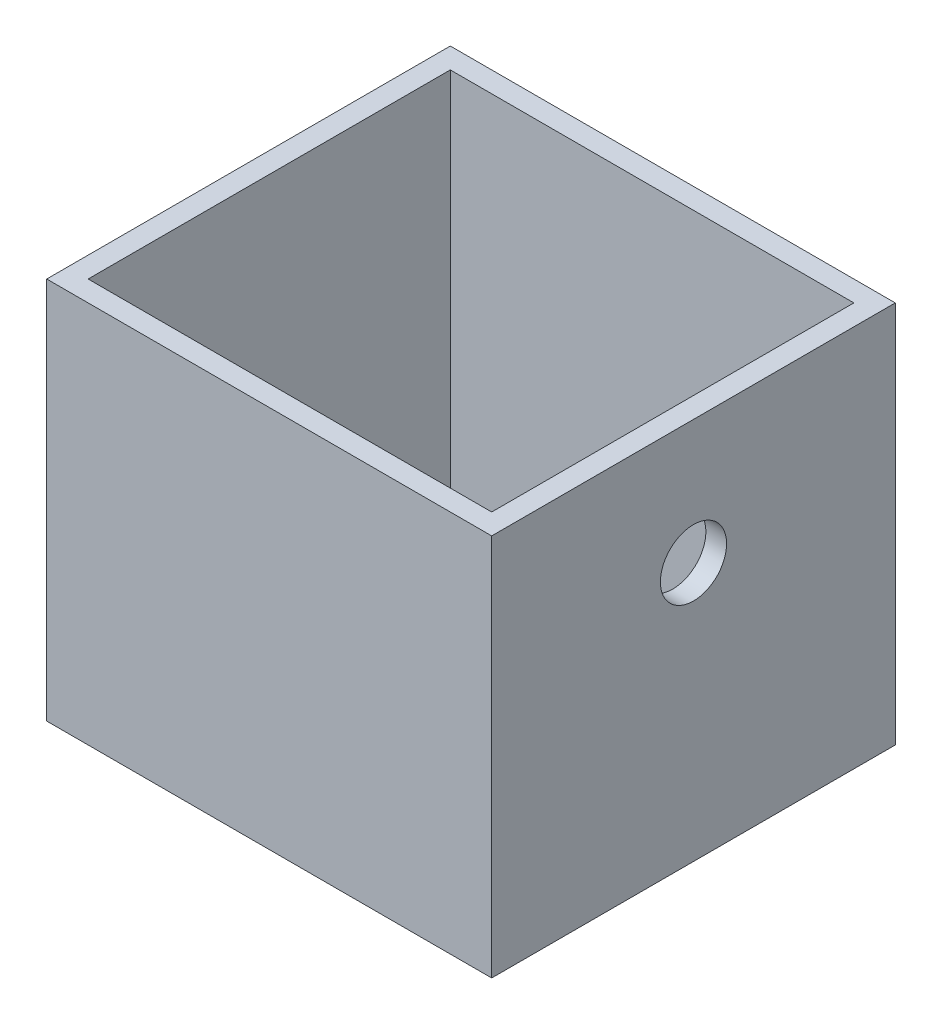
ISO-10303-21;
HEADER;
FILE_DESCRIPTION(('STEP AP214'),'2;1');
FILE_NAME('part.step','',(''),(''),'','','');
FILE_SCHEMA(('AUTOMOTIVE_DESIGN { 1 0 10303 214 1 1 1 1 }'));
ENDSEC;
DATA;
#1=APPLICATION_CONTEXT('core data for automotive mechanical design processes');
#2=APPLICATION_PROTOCOL_DEFINITION('international standard','automotive_design',2000,#1);
#3=PRODUCT_CONTEXT('',#1,'mechanical');
#4=PRODUCT('Part','Part','',(#3));
#5=PRODUCT_RELATED_PRODUCT_CATEGORY('part','',(#4));
#6=PRODUCT_DEFINITION_FORMATION('','',#4);
#7=PRODUCT_DEFINITION_CONTEXT('part definition',#1,'design');
#8=PRODUCT_DEFINITION('design','',#6,#7);
#9=PRODUCT_DEFINITION_SHAPE('','',#8);
#10=(LENGTH_UNIT() NAMED_UNIT(*) SI_UNIT(.MILLI.,.METRE.));
#11=(NAMED_UNIT(*) PLANE_ANGLE_UNIT() SI_UNIT($,.RADIAN.));
#12=(NAMED_UNIT(*) SI_UNIT($,.STERADIAN.) SOLID_ANGLE_UNIT());
#13=UNCERTAINTY_MEASURE_WITH_UNIT(LENGTH_MEASURE(1.E-05),#10,'distance_accuracy_value','');
#14=(GEOMETRIC_REPRESENTATION_CONTEXT(3) GLOBAL_UNCERTAINTY_ASSIGNED_CONTEXT((#13)) GLOBAL_UNIT_ASSIGNED_CONTEXT((#10,
#11,#12)) REPRESENTATION_CONTEXT('',''));
#15=CARTESIAN_POINT('',(0.,0.,0.));
#16=DIRECTION('',(0.,0.,1.));
#17=DIRECTION('',(1.,0.,0.));
#18=AXIS2_PLACEMENT_3D('',#15,#16,#17);
#19=CARTESIAN_POINT('',(215.,370.,-195.));
#20=DIRECTION('',(-1.,0.,0.));
#21=DIRECTION('',(0.,0.,1.));
#22=AXIS2_PLACEMENT_3D('',#19,#20,#21);
#23=PLANE('',#22);
#24=CARTESIAN_POINT('',(215.,250.,0.));
#25=DIRECTION('',(1.,0.,0.));
#26=DIRECTION('',(0.,0.,-1.));
#27=AXIS2_PLACEMENT_3D('',#24,#25,#26);
#28=CIRCLE('',#27,32.);
#29=CARTESIAN_POINT('',(215.,250.,-32.0000000000001));
#30=VERTEX_POINT('',#29);
#31=EDGE_CURVE('E189',#30,#30,#28,.T.);
#32=ORIENTED_EDGE('',*,*,#31,.F.);
#33=EDGE_LOOP('',(#32));
#34=FACE_BOUND('',#33,.T.);
#35=DIRECTION('',(0.,0.,-1.));
#36=VECTOR('',#35,1.);
#37=CARTESIAN_POINT('',(215.,0.,-195.));
#38=LINE('',#37,#36);
#39=CARTESIAN_POINT('',(215.,0.,195.));
#40=VERTEX_POINT('',#39);
#41=CARTESIAN_POINT('',(215.,0.,-195.));
#42=VERTEX_POINT('',#41);
#43=EDGE_CURVE('E147',#40,#42,#38,.T.);
#44=ORIENTED_EDGE('',*,*,#43,.T.);
#45=DIRECTION('',(0.,-1.,0.));
#46=VECTOR('',#45,1.);
#47=CARTESIAN_POINT('',(215.,370.,-195.));
#48=LINE('',#47,#46);
#49=CARTESIAN_POINT('',(215.,370.,-195.));
#50=VERTEX_POINT('',#49);
#51=EDGE_CURVE('E11',#50,#42,#48,.T.);
#52=ORIENTED_EDGE('',*,*,#51,.F.);
#53=DIRECTION('',(0.,0.,-1.));
#54=VECTOR('',#53,1.);
#55=CARTESIAN_POINT('',(215.,370.,-195.));
#56=LINE('',#55,#54);
#57=CARTESIAN_POINT('',(215.,370.,195.));
#58=VERTEX_POINT('',#57);
#59=EDGE_CURVE('E140',#58,#50,#56,.T.);
#60=ORIENTED_EDGE('',*,*,#59,.F.);
#61=DIRECTION('',(0.,-1.,0.));
#62=VECTOR('',#61,1.);
#63=CARTESIAN_POINT('',(215.,370.,195.));
#64=LINE('',#63,#62);
#65=EDGE_CURVE('E146',#58,#40,#64,.T.);
#66=ORIENTED_EDGE('',*,*,#65,.T.);
#67=EDGE_LOOP('',(#44,#52,#60,#66));
#68=FACE_BOUND('',#67,.T.);
#69=ADVANCED_FACE('F33',(#34,#68),#23,.F.);
#70=CARTESIAN_POINT('',(-215.,370.,-195.));
#71=DIRECTION('',(0.,0.,1.));
#72=DIRECTION('',(1.,0.,0.));
#73=AXIS2_PLACEMENT_3D('',#70,#71,#72);
#74=PLANE('',#73);
#75=DIRECTION('',(-1.,0.,0.));
#76=VECTOR('',#75,1.);
#77=CARTESIAN_POINT('',(-215.,0.,-195.));
#78=LINE('',#77,#76);
#79=CARTESIAN_POINT('',(-215.,0.,-195.));
#80=VERTEX_POINT('',#79);
#81=EDGE_CURVE('E150',#42,#80,#78,.T.);
#82=ORIENTED_EDGE('',*,*,#81,.T.);
#83=DIRECTION('',(0.,-1.,0.));
#84=VECTOR('',#83,1.);
#85=CARTESIAN_POINT('',(-215.,370.,-195.));
#86=LINE('',#85,#84);
#87=CARTESIAN_POINT('',(-215.,370.,-195.));
#88=VERTEX_POINT('',#87);
#89=EDGE_CURVE('E40',#88,#80,#86,.T.);
#90=ORIENTED_EDGE('',*,*,#89,.F.);
#91=DIRECTION('',(-1.,0.,0.));
#92=VECTOR('',#91,1.);
#93=CARTESIAN_POINT('',(-215.,370.,-195.));
#94=LINE('',#93,#92);
#95=EDGE_CURVE('E84',#50,#88,#94,.T.);
#96=ORIENTED_EDGE('',*,*,#95,.F.);
#97=ORIENTED_EDGE('',*,*,#51,.T.);
#98=EDGE_LOOP('',(#82,#90,#96,#97));
#99=FACE_BOUND('',#98,.T.);
#100=ADVANCED_FACE('F179',(#99),#74,.F.);
#101=CARTESIAN_POINT('',(-215.,370.,-195.));
#102=DIRECTION('',(1.,0.,0.));
#103=DIRECTION('',(0.,0.,-1.));
#104=AXIS2_PLACEMENT_3D('',#101,#102,#103);
#105=PLANE('',#104);
#106=DIRECTION('',(0.,0.,1.));
#107=VECTOR('',#106,1.);
#108=CARTESIAN_POINT('',(-215.,0.,-195.));
#109=LINE('',#108,#107);
#110=CARTESIAN_POINT('',(-215.,0.,195.));
#111=VERTEX_POINT('',#110);
#112=EDGE_CURVE('E152',#80,#111,#109,.T.);
#113=ORIENTED_EDGE('',*,*,#112,.T.);
#114=DIRECTION('',(0.,-1.,0.));
#115=VECTOR('',#114,1.);
#116=CARTESIAN_POINT('',(-215.,370.,195.));
#117=LINE('',#116,#115);
#118=CARTESIAN_POINT('',(-215.,370.,195.));
#119=VERTEX_POINT('',#118);
#120=EDGE_CURVE('E156',#119,#111,#117,.T.);
#121=ORIENTED_EDGE('',*,*,#120,.F.);
#122=DIRECTION('',(0.,0.,1.));
#123=VECTOR('',#122,1.);
#124=CARTESIAN_POINT('',(-215.,370.,-195.));
#125=LINE('',#124,#123);
#126=EDGE_CURVE('E143',#88,#119,#125,.T.);
#127=ORIENTED_EDGE('',*,*,#126,.F.);
#128=ORIENTED_EDGE('',*,*,#89,.T.);
#129=EDGE_LOOP('',(#113,#121,#127,#128));
#130=FACE_BOUND('',#129,.T.);
#131=ADVANCED_FACE('F161',(#130),#105,.F.);
#132=CARTESIAN_POINT('',(-215.,370.,195.));
#133=DIRECTION('',(0.,0.,-1.));
#134=DIRECTION('',(-1.,0.,0.));
#135=AXIS2_PLACEMENT_3D('',#132,#133,#134);
#136=PLANE('',#135);
#137=DIRECTION('',(1.,0.,0.));
#138=VECTOR('',#137,1.);
#139=CARTESIAN_POINT('',(-215.,0.,195.));
#140=LINE('',#139,#138);
#141=EDGE_CURVE('E77',#111,#40,#140,.T.);
#142=ORIENTED_EDGE('',*,*,#141,.T.);
#143=ORIENTED_EDGE('',*,*,#65,.F.);
#144=DIRECTION('',(1.,0.,0.));
#145=VECTOR('',#144,1.);
#146=CARTESIAN_POINT('',(-215.,370.,195.));
#147=LINE('',#146,#145);
#148=EDGE_CURVE('E56',#119,#58,#147,.T.);
#149=ORIENTED_EDGE('',*,*,#148,.F.);
#150=ORIENTED_EDGE('',*,*,#120,.T.);
#151=EDGE_LOOP('',(#142,#143,#149,#150));
#152=FACE_BOUND('',#151,.T.);
#153=ADVANCED_FACE('F169',(#152),#136,.F.);
#154=CARTESIAN_POINT('',(0.,370.,0.));
#155=DIRECTION('',(0.,1.,0.));
#156=DIRECTION('',(0.,0.,1.));
#157=AXIS2_PLACEMENT_3D('',#154,#155,#156);
#158=PLANE('',#157);
#159=DIRECTION('',(0.,0.,-1.));
#160=VECTOR('',#159,1.);
#161=CARTESIAN_POINT('',(195.,370.,-195.));
#162=LINE('',#161,#160);
#163=CARTESIAN_POINT('',(195.,370.,175.));
#164=VERTEX_POINT('',#163);
#165=CARTESIAN_POINT('',(195.,370.,-175.));
#166=VERTEX_POINT('',#165);
#167=EDGE_CURVE('E129',#164,#166,#162,.T.);
#168=ORIENTED_EDGE('',*,*,#167,.F.);
#169=DIRECTION('',(1.,0.,0.));
#170=VECTOR('',#169,1.);
#171=CARTESIAN_POINT('',(-215.,370.,175.));
#172=LINE('',#171,#170);
#173=CARTESIAN_POINT('',(-195.,370.,175.));
#174=VERTEX_POINT('',#173);
#175=EDGE_CURVE('E138',#174,#164,#172,.T.);
#176=ORIENTED_EDGE('',*,*,#175,.F.);
#177=DIRECTION('',(0.,0.,1.));
#178=VECTOR('',#177,1.);
#179=CARTESIAN_POINT('',(-195.,370.,-195.));
#180=LINE('',#179,#178);
#181=CARTESIAN_POINT('',(-195.,370.,-175.));
#182=VERTEX_POINT('',#181);
#183=EDGE_CURVE('E136',#182,#174,#180,.T.);
#184=ORIENTED_EDGE('',*,*,#183,.F.);
#185=DIRECTION('',(-1.,0.,0.));
#186=VECTOR('',#185,1.);
#187=CARTESIAN_POINT('',(-215.,370.,-175.));
#188=LINE('',#187,#186);
#189=EDGE_CURVE('E121',#166,#182,#188,.T.);
#190=ORIENTED_EDGE('',*,*,#189,.F.);
#191=EDGE_LOOP('',(#168,#176,#184,#190));
#192=FACE_BOUND('',#191,.T.);
#193=ORIENTED_EDGE('',*,*,#59,.T.);
#194=ORIENTED_EDGE('',*,*,#95,.T.);
#195=ORIENTED_EDGE('',*,*,#126,.T.);
#196=ORIENTED_EDGE('',*,*,#148,.T.);
#197=EDGE_LOOP('',(#193,#194,#195,#196));
#198=FACE_BOUND('',#197,.T.);
#199=ADVANCED_FACE('F171',(#192,#198),#158,.T.);
#200=CARTESIAN_POINT('',(0.,0.,0.));
#201=DIRECTION('',(0.,1.,0.));
#202=DIRECTION('',(0.,0.,1.));
#203=AXIS2_PLACEMENT_3D('',#200,#201,#202);
#204=PLANE('',#203);
#205=ORIENTED_EDGE('',*,*,#43,.F.);
#206=ORIENTED_EDGE('',*,*,#141,.F.);
#207=ORIENTED_EDGE('',*,*,#112,.F.);
#208=ORIENTED_EDGE('',*,*,#81,.F.);
#209=EDGE_LOOP('',(#205,#206,#207,#208));
#210=FACE_BOUND('',#209,.T.);
#211=ADVANCED_FACE('F165',(#210),#204,.F.);
#212=CARTESIAN_POINT('',(195.,370.,-195.));
#213=DIRECTION('',(-1.,0.,0.));
#214=DIRECTION('',(0.,0.,1.));
#215=AXIS2_PLACEMENT_3D('',#212,#213,#214);
#216=PLANE('',#215);
#217=CARTESIAN_POINT('',(195.,250.,0.));
#218=DIRECTION('',(-1.,0.,0.));
#219=DIRECTION('',(0.,0.,1.));
#220=AXIS2_PLACEMENT_3D('',#217,#218,#219);
#221=CIRCLE('',#220,32.);
#222=CARTESIAN_POINT('',(195.,250.,32.));
#223=VERTEX_POINT('',#222);
#224=EDGE_CURVE('E191',#223,#223,#221,.F.);
#225=ORIENTED_EDGE('',*,*,#224,.T.);
#226=EDGE_LOOP('',(#225));
#227=FACE_BOUND('',#226,.T.);
#228=DIRECTION('',(0.,0.,-1.));
#229=VECTOR('',#228,1.);
#230=CARTESIAN_POINT('',(195.,20.,-195.));
#231=LINE('',#230,#229);
#232=CARTESIAN_POINT('',(195.,20.,175.));
#233=VERTEX_POINT('',#232);
#234=CARTESIAN_POINT('',(195.,20.,-175.));
#235=VERTEX_POINT('',#234);
#236=EDGE_CURVE('E112',#233,#235,#231,.T.);
#237=ORIENTED_EDGE('',*,*,#236,.F.);
#238=DIRECTION('',(0.,-1.,0.));
#239=VECTOR('',#238,1.);
#240=CARTESIAN_POINT('',(195.,370.,175.));
#241=LINE('',#240,#239);
#242=EDGE_CURVE('E132',#164,#233,#241,.T.);
#243=ORIENTED_EDGE('',*,*,#242,.F.);
#244=ORIENTED_EDGE('',*,*,#167,.T.);
#245=DIRECTION('',(0.,-1.,0.));
#246=VECTOR('',#245,1.);
#247=CARTESIAN_POINT('',(195.,370.,-175.));
#248=LINE('',#247,#246);
#249=EDGE_CURVE('E124',#166,#235,#248,.T.);
#250=ORIENTED_EDGE('',*,*,#249,.T.);
#251=EDGE_LOOP('',(#237,#243,#244,#250));
#252=FACE_BOUND('',#251,.T.);
#253=ADVANCED_FACE('F204',(#227,#252),#216,.T.);
#254=CARTESIAN_POINT('',(-215.,370.,-175.));
#255=DIRECTION('',(0.,0.,1.));
#256=DIRECTION('',(1.,0.,0.));
#257=AXIS2_PLACEMENT_3D('',#254,#255,#256);
#258=PLANE('',#257);
#259=DIRECTION('',(-1.,0.,0.));
#260=VECTOR('',#259,1.);
#261=CARTESIAN_POINT('',(-215.,20.,-175.));
#262=LINE('',#261,#260);
#263=CARTESIAN_POINT('',(-195.,20.,-175.));
#264=VERTEX_POINT('',#263);
#265=EDGE_CURVE('E106',#235,#264,#262,.T.);
#266=ORIENTED_EDGE('',*,*,#265,.F.);
#267=ORIENTED_EDGE('',*,*,#249,.F.);
#268=ORIENTED_EDGE('',*,*,#189,.T.);
#269=DIRECTION('',(0.,-1.,0.));
#270=VECTOR('',#269,1.);
#271=CARTESIAN_POINT('',(-195.,370.,-175.));
#272=LINE('',#271,#270);
#273=EDGE_CURVE('E118',#182,#264,#272,.T.);
#274=ORIENTED_EDGE('',*,*,#273,.T.);
#275=EDGE_LOOP('',(#266,#267,#268,#274));
#276=FACE_BOUND('',#275,.T.);
#277=ADVANCED_FACE('F119',(#276),#258,.T.);
#278=CARTESIAN_POINT('',(-195.,370.,-195.));
#279=DIRECTION('',(1.,0.,0.));
#280=DIRECTION('',(0.,0.,-1.));
#281=AXIS2_PLACEMENT_3D('',#278,#279,#280);
#282=PLANE('',#281);
#283=DIRECTION('',(0.,0.,1.));
#284=VECTOR('',#283,1.);
#285=CARTESIAN_POINT('',(-195.,20.,-195.));
#286=LINE('',#285,#284);
#287=CARTESIAN_POINT('',(-195.,20.,175.));
#288=VERTEX_POINT('',#287);
#289=EDGE_CURVE('E110',#264,#288,#286,.T.);
#290=ORIENTED_EDGE('',*,*,#289,.F.);
#291=ORIENTED_EDGE('',*,*,#273,.F.);
#292=ORIENTED_EDGE('',*,*,#183,.T.);
#293=DIRECTION('',(0.,-1.,0.));
#294=VECTOR('',#293,1.);
#295=CARTESIAN_POINT('',(-195.,370.,175.));
#296=LINE('',#295,#294);
#297=EDGE_CURVE('E47',#174,#288,#296,.T.);
#298=ORIENTED_EDGE('',*,*,#297,.T.);
#299=EDGE_LOOP('',(#290,#291,#292,#298));
#300=FACE_BOUND('',#299,.T.);
#301=ADVANCED_FACE('F126',(#300),#282,.T.);
#302=CARTESIAN_POINT('',(-215.,370.,175.));
#303=DIRECTION('',(0.,0.,-1.));
#304=DIRECTION('',(-1.,0.,0.));
#305=AXIS2_PLACEMENT_3D('',#302,#303,#304);
#306=PLANE('',#305);
#307=DIRECTION('',(1.,0.,0.));
#308=VECTOR('',#307,1.);
#309=CARTESIAN_POINT('',(-215.,20.,175.));
#310=LINE('',#309,#308);
#311=EDGE_CURVE('E127',#288,#233,#310,.T.);
#312=ORIENTED_EDGE('',*,*,#311,.F.);
#313=ORIENTED_EDGE('',*,*,#297,.F.);
#314=ORIENTED_EDGE('',*,*,#175,.T.);
#315=ORIENTED_EDGE('',*,*,#242,.T.);
#316=EDGE_LOOP('',(#312,#313,#314,#315));
#317=FACE_BOUND('',#316,.T.);
#318=ADVANCED_FACE('F200',(#317),#306,.T.);
#319=CARTESIAN_POINT('',(0.,20.,0.));
#320=DIRECTION('',(0.,1.,0.));
#321=DIRECTION('',(0.,0.,1.));
#322=AXIS2_PLACEMENT_3D('',#319,#320,#321);
#323=PLANE('',#322);
#324=ORIENTED_EDGE('',*,*,#236,.T.);
#325=ORIENTED_EDGE('',*,*,#265,.T.);
#326=ORIENTED_EDGE('',*,*,#289,.T.);
#327=ORIENTED_EDGE('',*,*,#311,.T.);
#328=EDGE_LOOP('',(#324,#325,#326,#327));
#329=FACE_BOUND('',#328,.T.);
#330=ADVANCED_FACE('F108',(#329),#323,.T.);
#331=CARTESIAN_POINT('',(-215.002,250.,0.));
#332=DIRECTION('',(1.,0.,0.));
#333=DIRECTION('',(0.,0.,-1.));
#334=AXIS2_PLACEMENT_3D('',#331,#332,#333);
#335=CYLINDRICAL_SURFACE('',#334,32.);
#336=ORIENTED_EDGE('',*,*,#31,.T.);
#337=EDGE_LOOP('',(#336));
#338=FACE_BOUND('',#337,.T.);
#339=ORIENTED_EDGE('',*,*,#224,.F.);
#340=EDGE_LOOP('',(#339));
#341=FACE_BOUND('',#340,.T.);
#342=ADVANCED_FACE('F214',(#338,#341),#335,.F.);
#343=CLOSED_SHELL('',(#69,#100,#131,#153,#199,#211,#253,#277,#301,#318,#330,#342));
#344=MANIFOLD_SOLID_BREP('B2',#343);
#345=ADVANCED_BREP_SHAPE_REPRESENTATION('',(#18,#344),#14);
#346=SHAPE_DEFINITION_REPRESENTATION(#9,#345);
ENDSEC;
END-ISO-10303-21;
